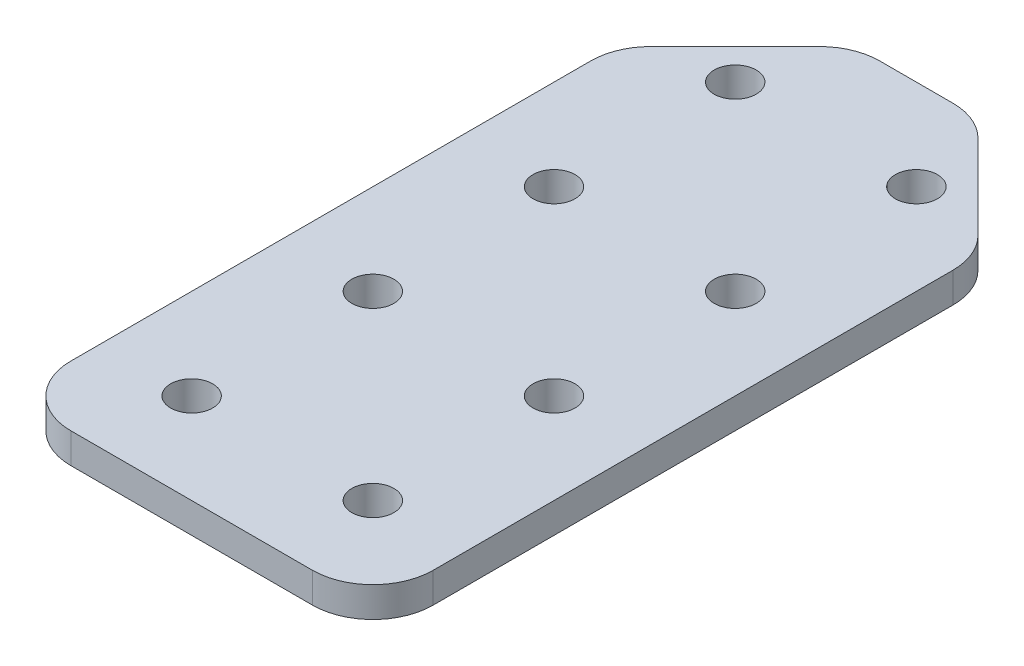
ISO-10303-21;
HEADER;
FILE_DESCRIPTION(('STEP AP214'),'2;1');
FILE_NAME('part.step','',(''),(''),'','','');
FILE_SCHEMA(('AUTOMOTIVE_DESIGN { 1 0 10303 214 1 1 1 1 }'));
ENDSEC;
DATA;
#1=APPLICATION_CONTEXT('core data for automotive mechanical design processes');
#2=APPLICATION_PROTOCOL_DEFINITION('international standard','automotive_design',2000,#1);
#3=PRODUCT_CONTEXT('',#1,'mechanical');
#4=PRODUCT('Part','Part','',(#3));
#5=PRODUCT_RELATED_PRODUCT_CATEGORY('part','',(#4));
#6=PRODUCT_DEFINITION_FORMATION('','',#4);
#7=PRODUCT_DEFINITION_CONTEXT('part definition',#1,'design');
#8=PRODUCT_DEFINITION('design','',#6,#7);
#9=PRODUCT_DEFINITION_SHAPE('','',#8);
#10=(LENGTH_UNIT() NAMED_UNIT(*) SI_UNIT(.MILLI.,.METRE.));
#11=(NAMED_UNIT(*) PLANE_ANGLE_UNIT() SI_UNIT($,.RADIAN.));
#12=(NAMED_UNIT(*) SI_UNIT($,.STERADIAN.) SOLID_ANGLE_UNIT());
#13=UNCERTAINTY_MEASURE_WITH_UNIT(LENGTH_MEASURE(1.E-05),#10,'distance_accuracy_value','');
#14=(GEOMETRIC_REPRESENTATION_CONTEXT(3) GLOBAL_UNCERTAINTY_ASSIGNED_CONTEXT((#13)) GLOBAL_UNIT_ASSIGNED_CONTEXT((#10,
#11,#12)) REPRESENTATION_CONTEXT('',''));
#15=CARTESIAN_POINT('',(0.,0.,0.));
#16=DIRECTION('',(0.,0.,1.));
#17=DIRECTION('',(1.,0.,0.));
#18=AXIS2_PLACEMENT_3D('',#15,#16,#17);
#19=CARTESIAN_POINT('',(38.1,3.175,76.2));
#20=DIRECTION('',(-1.,0.,0.));
#21=DIRECTION('',(0.,0.,1.));
#22=AXIS2_PLACEMENT_3D('',#19,#20,#21);
#23=PLANE('',#22);
#24=DIRECTION('',(0.,0.,-1.));
#25=VECTOR('',#24,1.);
#26=CARTESIAN_POINT('',(38.1,3.175,76.2));
#27=LINE('',#26,#25);
#28=CARTESIAN_POINT('',(38.1,3.175,63.5));
#29=VERTEX_POINT('',#28);
#30=CARTESIAN_POINT('',(38.1,3.175,-45.794770618868));
#31=VERTEX_POINT('',#30);
#32=EDGE_CURVE('E213',#29,#31,#27,.T.);
#33=ORIENTED_EDGE('',*,*,#32,.F.);
#34=DIRECTION('',(0.,-1.,0.));
#35=VECTOR('',#34,1.);
#36=CARTESIAN_POINT('',(38.1,3.175,63.5));
#37=LINE('',#36,#35);
#38=CARTESIAN_POINT('',(38.1,-3.175,63.5));
#39=VERTEX_POINT('',#38);
#40=EDGE_CURVE('E11',#29,#39,#37,.T.);
#41=ORIENTED_EDGE('',*,*,#40,.T.);
#42=DIRECTION('',(0.,0.,-1.));
#43=VECTOR('',#42,1.);
#44=CARTESIAN_POINT('',(38.1,-3.175,76.2));
#45=LINE('',#44,#43);
#46=CARTESIAN_POINT('',(38.1,-3.175,-45.794770618868));
#47=VERTEX_POINT('',#46);
#48=EDGE_CURVE('E210',#39,#47,#45,.T.);
#49=ORIENTED_EDGE('',*,*,#48,.T.);
#50=DIRECTION('',(0.,1.,0.));
#51=VECTOR('',#50,1.);
#52=CARTESIAN_POINT('',(38.1,3.175,-45.794770618868));
#53=LINE('',#52,#51);
#54=EDGE_CURVE('E47',#47,#31,#53,.T.);
#55=ORIENTED_EDGE('',*,*,#54,.T.);
#56=EDGE_LOOP('',(#33,#41,#49,#55));
#57=FACE_BOUND('',#56,.T.);
#58=ADVANCED_FACE('F39',(#57),#23,.F.);
#59=CARTESIAN_POINT('',(-38.1,3.175,-76.2));
#60=DIRECTION('',(0.,0.,1.));
#61=DIRECTION('',(1.,0.,0.));
#62=AXIS2_PLACEMENT_3D('',#59,#60,#61);
#63=PLANE('',#62);
#64=DIRECTION('',(-1.,0.,0.));
#65=VECTOR('',#64,1.);
#66=CARTESIAN_POINT('',(-38.1,3.175,-76.2));
#67=LINE('',#66,#65);
#68=CARTESIAN_POINT('',(7.69477061886781,3.175,-76.2));
#69=VERTEX_POINT('',#68);
#70=CARTESIAN_POINT('',(-7.6947706188681,3.175,-76.2));
#71=VERTEX_POINT('',#70);
#72=EDGE_CURVE('E215',#69,#71,#67,.T.);
#73=ORIENTED_EDGE('',*,*,#72,.F.);
#74=DIRECTION('',(0.,1.,0.));
#75=VECTOR('',#74,1.);
#76=CARTESIAN_POINT('',(7.69477061886782,3.175,-76.2));
#77=LINE('',#76,#75);
#78=CARTESIAN_POINT('',(7.69477061886781,-3.175,-76.2));
#79=VERTEX_POINT('',#78);
#80=EDGE_CURVE('E135',#69,#79,#77,.F.);
#81=ORIENTED_EDGE('',*,*,#80,.T.);
#82=DIRECTION('',(-1.,0.,0.));
#83=VECTOR('',#82,1.);
#84=CARTESIAN_POINT('',(-38.1,-3.175,-76.2));
#85=LINE('',#84,#83);
#86=CARTESIAN_POINT('',(-7.6947706188681,-3.175,-76.2));
#87=VERTEX_POINT('',#86);
#88=EDGE_CURVE('E226',#79,#87,#85,.T.);
#89=ORIENTED_EDGE('',*,*,#88,.T.);
#90=DIRECTION('',(0.,1.,0.));
#91=VECTOR('',#90,1.);
#92=CARTESIAN_POINT('',(-7.69477061886809,3.175,-76.2));
#93=LINE('',#92,#91);
#94=EDGE_CURVE('E140',#87,#71,#93,.T.);
#95=ORIENTED_EDGE('',*,*,#94,.T.);
#96=EDGE_LOOP('',(#73,#81,#89,#95));
#97=FACE_BOUND('',#96,.T.);
#98=ADVANCED_FACE('F295',(#97),#63,.F.);
#99=CARTESIAN_POINT('',(-38.1,3.175,76.2));
#100=DIRECTION('',(1.,0.,0.));
#101=DIRECTION('',(0.,0.,-1.));
#102=AXIS2_PLACEMENT_3D('',#99,#100,#101);
#103=PLANE('',#102);
#104=DIRECTION('',(0.,0.,1.));
#105=VECTOR('',#104,1.);
#106=CARTESIAN_POINT('',(-38.1,3.175,76.2));
#107=LINE('',#106,#105);
#108=CARTESIAN_POINT('',(-38.1,3.175,-45.794770618868));
#109=VERTEX_POINT('',#108);
#110=CARTESIAN_POINT('',(-38.1,3.175,63.5));
#111=VERTEX_POINT('',#110);
#112=EDGE_CURVE('E218',#109,#111,#107,.T.);
#113=ORIENTED_EDGE('',*,*,#112,.F.);
#114=DIRECTION('',(0.,1.,0.));
#115=VECTOR('',#114,1.);
#116=CARTESIAN_POINT('',(-38.1,3.175,-45.7947706188681));
#117=LINE('',#116,#115);
#118=CARTESIAN_POINT('',(-38.1,-3.175,-45.794770618868));
#119=VERTEX_POINT('',#118);
#120=EDGE_CURVE('E262',#109,#119,#117,.F.);
#121=ORIENTED_EDGE('',*,*,#120,.T.);
#122=DIRECTION('',(0.,0.,1.));
#123=VECTOR('',#122,1.);
#124=CARTESIAN_POINT('',(-38.1,-3.175,76.2));
#125=LINE('',#124,#123);
#126=CARTESIAN_POINT('',(-38.1,-3.175,63.5));
#127=VERTEX_POINT('',#126);
#128=EDGE_CURVE('E229',#119,#127,#125,.T.);
#129=ORIENTED_EDGE('',*,*,#128,.T.);
#130=DIRECTION('',(0.,-1.,0.));
#131=VECTOR('',#130,1.);
#132=CARTESIAN_POINT('',(-38.1,3.175,63.5));
#133=LINE('',#132,#131);
#134=EDGE_CURVE('E260',#127,#111,#133,.F.);
#135=ORIENTED_EDGE('',*,*,#134,.T.);
#136=EDGE_LOOP('',(#113,#121,#129,#135));
#137=FACE_BOUND('',#136,.T.);
#138=ADVANCED_FACE('F300',(#137),#103,.F.);
#139=CARTESIAN_POINT('',(-38.1,3.175,76.2));
#140=DIRECTION('',(0.,0.,-1.));
#141=DIRECTION('',(-1.,0.,0.));
#142=AXIS2_PLACEMENT_3D('',#139,#140,#141);
#143=PLANE('',#142);
#144=DIRECTION('',(1.,0.,0.));
#145=VECTOR('',#144,1.);
#146=CARTESIAN_POINT('',(-38.1,3.175,76.2));
#147=LINE('',#146,#145);
#148=CARTESIAN_POINT('',(-25.4,3.175,76.2));
#149=VERTEX_POINT('',#148);
#150=CARTESIAN_POINT('',(25.4,3.175,76.2));
#151=VERTEX_POINT('',#150);
#152=EDGE_CURVE('E221',#149,#151,#147,.T.);
#153=ORIENTED_EDGE('',*,*,#152,.F.);
#154=DIRECTION('',(0.,-1.,0.));
#155=VECTOR('',#154,1.);
#156=CARTESIAN_POINT('',(-25.4,3.175,76.2));
#157=LINE('',#156,#155);
#158=CARTESIAN_POINT('',(-25.4,-3.175,76.2));
#159=VERTEX_POINT('',#158);
#160=EDGE_CURVE('E266',#149,#159,#157,.T.);
#161=ORIENTED_EDGE('',*,*,#160,.T.);
#162=DIRECTION('',(1.,0.,0.));
#163=VECTOR('',#162,1.);
#164=CARTESIAN_POINT('',(-38.1,-3.175,76.2));
#165=LINE('',#164,#163);
#166=CARTESIAN_POINT('',(25.4,-3.175,76.2));
#167=VERTEX_POINT('',#166);
#168=EDGE_CURVE('E216',#159,#167,#165,.T.);
#169=ORIENTED_EDGE('',*,*,#168,.T.);
#170=DIRECTION('',(0.,-1.,0.));
#171=VECTOR('',#170,1.);
#172=CARTESIAN_POINT('',(25.4,3.175,76.2));
#173=LINE('',#172,#171);
#174=EDGE_CURVE('E264',#167,#151,#173,.F.);
#175=ORIENTED_EDGE('',*,*,#174,.T.);
#176=EDGE_LOOP('',(#153,#161,#169,#175));
#177=FACE_BOUND('',#176,.T.);
#178=ADVANCED_FACE('F320',(#177),#143,.F.);
#179=CARTESIAN_POINT('',(0.,3.175,0.));
#180=DIRECTION('',(0.,-1.,0.));
#181=DIRECTION('',(0.,0.,-1.));
#182=AXIS2_PLACEMENT_3D('',#179,#180,#181);
#183=PLANE('',#182);
#184=CARTESIAN_POINT('',(19.0500000000012,3.175,57.15));
#185=DIRECTION('',(0.,1.,0.));
#186=DIRECTION('',(0.,0.,1.));
#187=AXIS2_PLACEMENT_3D('',#184,#185,#186);
#188=CIRCLE('',#187,4.4196);
#189=CARTESIAN_POINT('',(19.0500000000012,3.175,61.5696));
#190=VERTEX_POINT('',#189);
#191=EDGE_CURVE('E181',#190,#190,#188,.T.);
#192=ORIENTED_EDGE('',*,*,#191,.F.);
#193=EDGE_LOOP('',(#192));
#194=FACE_BOUND('',#193,.T.);
#195=CARTESIAN_POINT('',(-19.0499999999996,3.175,-19.05));
#196=DIRECTION('',(0.,1.,0.));
#197=DIRECTION('',(0.,0.,1.));
#198=AXIS2_PLACEMENT_3D('',#195,#196,#197);
#199=CIRCLE('',#198,4.4196);
#200=CARTESIAN_POINT('',(-19.0499999999996,3.175,-14.6304));
#201=VERTEX_POINT('',#200);
#202=EDGE_CURVE('E168',#201,#201,#199,.T.);
#203=ORIENTED_EDGE('',*,*,#202,.F.);
#204=EDGE_LOOP('',(#203));
#205=FACE_BOUND('',#204,.T.);
#206=CARTESIAN_POINT('',(-19.0499999999992,3.175,19.05));
#207=DIRECTION('',(0.,1.,0.));
#208=DIRECTION('',(0.,0.,1.));
#209=AXIS2_PLACEMENT_3D('',#206,#207,#208);
#210=CIRCLE('',#209,4.4196);
#211=CARTESIAN_POINT('',(-19.0499999999992,3.175,23.4696));
#212=VERTEX_POINT('',#211);
#213=EDGE_CURVE('E169',#212,#212,#210,.T.);
#214=ORIENTED_EDGE('',*,*,#213,.F.);
#215=EDGE_LOOP('',(#214));
#216=FACE_BOUND('',#215,.T.);
#217=CARTESIAN_POINT('',(-19.0499999999988,3.175,57.15));
#218=DIRECTION('',(0.,1.,0.));
#219=DIRECTION('',(0.,0.,1.));
#220=AXIS2_PLACEMENT_3D('',#217,#218,#219);
#221=CIRCLE('',#220,4.4196);
#222=CARTESIAN_POINT('',(-19.0499999999988,3.175,61.5696));
#223=VERTEX_POINT('',#222);
#224=EDGE_CURVE('E163',#223,#223,#221,.T.);
#225=ORIENTED_EDGE('',*,*,#224,.F.);
#226=EDGE_LOOP('',(#225));
#227=FACE_BOUND('',#226,.T.);
#228=CARTESIAN_POINT('',(19.0500000000008,3.175,19.05));
#229=DIRECTION('',(0.,1.,0.));
#230=DIRECTION('',(0.,0.,1.));
#231=AXIS2_PLACEMENT_3D('',#228,#229,#230);
#232=CIRCLE('',#231,4.4196);
#233=CARTESIAN_POINT('',(19.0500000000008,3.175,23.4696));
#234=VERTEX_POINT('',#233);
#235=EDGE_CURVE('E180',#234,#234,#232,.T.);
#236=ORIENTED_EDGE('',*,*,#235,.F.);
#237=EDGE_LOOP('',(#236));
#238=FACE_BOUND('',#237,.T.);
#239=CARTESIAN_POINT('',(19.0500000000004,3.175,-19.05));
#240=DIRECTION('',(0.,1.,0.));
#241=DIRECTION('',(0.,0.,1.));
#242=AXIS2_PLACEMENT_3D('',#239,#240,#241);
#243=CIRCLE('',#242,4.4196);
#244=CARTESIAN_POINT('',(19.0500000000004,3.175,-14.6304));
#245=VERTEX_POINT('',#244);
#246=EDGE_CURVE('E199',#245,#245,#243,.T.);
#247=ORIENTED_EDGE('',*,*,#246,.F.);
#248=EDGE_LOOP('',(#247));
#249=FACE_BOUND('',#248,.T.);
#250=CARTESIAN_POINT('',(19.05,3.175,-57.15));
#251=DIRECTION('',(0.,1.,0.));
#252=DIRECTION('',(0.,0.,1.));
#253=AXIS2_PLACEMENT_3D('',#250,#251,#252);
#254=CIRCLE('',#253,4.4196);
#255=CARTESIAN_POINT('',(19.05,3.175,-52.7304));
#256=VERTEX_POINT('',#255);
#257=EDGE_CURVE('E193',#256,#256,#254,.T.);
#258=ORIENTED_EDGE('',*,*,#257,.F.);
#259=EDGE_LOOP('',(#258));
#260=FACE_BOUND('',#259,.T.);
#261=CARTESIAN_POINT('',(-19.05,3.175,-57.15));
#262=DIRECTION('',(0.,1.,0.));
#263=DIRECTION('',(0.,0.,1.));
#264=AXIS2_PLACEMENT_3D('',#261,#262,#263);
#265=CIRCLE('',#264,4.4196);
#266=CARTESIAN_POINT('',(-19.05,3.175,-52.7304));
#267=VERTEX_POINT('',#266);
#268=EDGE_CURVE('E192',#267,#267,#265,.T.);
#269=ORIENTED_EDGE('',*,*,#268,.F.);
#270=EDGE_LOOP('',(#269));
#271=FACE_BOUND('',#270,.T.);
#272=DIRECTION('',(0.707106781186551,0.,0.707106781186544));
#273=VECTOR('',#272,1.);
#274=CARTESIAN_POINT('',(38.1,3.175,-51.0552828610064));
#275=LINE('',#274,#273);
#276=CARTESIAN_POINT('',(16.6750267399369,3.175,-72.4802561210692));
#277=VERTEX_POINT('',#276);
#278=CARTESIAN_POINT('',(34.3802561210691,3.175,-54.7750267399372));
#279=VERTEX_POINT('',#278);
#280=EDGE_CURVE('E147',#277,#279,#275,.T.);
#281=ORIENTED_EDGE('',*,*,#280,.F.);
#282=CARTESIAN_POINT('',(7.69477061886782,3.175,-63.5));
#283=DIRECTION('',(0.,-1.,0.));
#284=DIRECTION('',(0.,0.,-1.));
#285=AXIS2_PLACEMENT_3D('',#282,#283,#284);
#286=CIRCLE('',#285,12.7);
#287=EDGE_CURVE('E130',#277,#69,#286,.F.);
#288=ORIENTED_EDGE('',*,*,#287,.T.);
#289=ORIENTED_EDGE('',*,*,#72,.T.);
#290=CARTESIAN_POINT('',(-7.69477061886809,3.175,-63.5));
#291=DIRECTION('',(0.,-1.,0.));
#292=DIRECTION('',(0.,0.,-1.));
#293=AXIS2_PLACEMENT_3D('',#290,#291,#292);
#294=CIRCLE('',#293,12.7);
#295=CARTESIAN_POINT('',(-16.6750267399372,3.175,-72.4802561210691));
#296=VERTEX_POINT('',#295);
#297=EDGE_CURVE('E151',#71,#296,#294,.F.);
#298=ORIENTED_EDGE('',*,*,#297,.T.);
#299=DIRECTION('',(0.707106781186547,0.,-0.707106781186548));
#300=VECTOR('',#299,1.);
#301=CARTESIAN_POINT('',(-38.1,3.175,-51.0552828610064));
#302=LINE('',#301,#300);
#303=CARTESIAN_POINT('',(-34.3802561210692,3.175,-54.7750267399372));
#304=VERTEX_POINT('',#303);
#305=EDGE_CURVE('E158',#304,#296,#302,.T.);
#306=ORIENTED_EDGE('',*,*,#305,.F.);
#307=CARTESIAN_POINT('',(-25.4,3.175,-45.7947706188681));
#308=DIRECTION('',(0.,-1.,0.));
#309=DIRECTION('',(0.,0.,-1.));
#310=AXIS2_PLACEMENT_3D('',#307,#308,#309);
#311=CIRCLE('',#310,12.7);
#312=EDGE_CURVE('E141',#304,#109,#311,.F.);
#313=ORIENTED_EDGE('',*,*,#312,.T.);
#314=ORIENTED_EDGE('',*,*,#112,.T.);
#315=CARTESIAN_POINT('',(-25.4,3.175,63.5));
#316=DIRECTION('',(0.,-1.,0.));
#317=DIRECTION('',(0.,0.,-1.));
#318=AXIS2_PLACEMENT_3D('',#315,#316,#317);
#319=CIRCLE('',#318,12.7);
#320=EDGE_CURVE('E239',#111,#149,#319,.F.);
#321=ORIENTED_EDGE('',*,*,#320,.T.);
#322=ORIENTED_EDGE('',*,*,#152,.T.);
#323=CARTESIAN_POINT('',(25.4,3.175,63.5));
#324=DIRECTION('',(0.,-1.,0.));
#325=DIRECTION('',(0.,0.,-1.));
#326=AXIS2_PLACEMENT_3D('',#323,#324,#325);
#327=CIRCLE('',#326,12.7);
#328=EDGE_CURVE('E237',#151,#29,#327,.F.);
#329=ORIENTED_EDGE('',*,*,#328,.T.);
#330=ORIENTED_EDGE('',*,*,#32,.T.);
#331=CARTESIAN_POINT('',(25.4,3.175,-45.794770618868));
#332=DIRECTION('',(0.,-1.,0.));
#333=DIRECTION('',(0.,0.,-1.));
#334=AXIS2_PLACEMENT_3D('',#331,#332,#333);
#335=CIRCLE('',#334,12.7);
#336=EDGE_CURVE('E156',#31,#279,#335,.F.);
#337=ORIENTED_EDGE('',*,*,#336,.T.);
#338=EDGE_LOOP('',(#281,#288,#289,#298,#306,#313,#314,#321,#322,#329,#330,#337));
#339=FACE_BOUND('',#338,.T.);
#340=ADVANCED_FACE('F154',(#194,#205,#216,#227,#238,#249,#260,#271,#339),#183,.F.);
#341=CARTESIAN_POINT('',(0.,-3.175,0.));
#342=DIRECTION('',(0.,-1.,0.));
#343=DIRECTION('',(0.,0.,-1.));
#344=AXIS2_PLACEMENT_3D('',#341,#342,#343);
#345=PLANE('',#344);
#346=ORIENTED_EDGE('',*,*,#88,.F.);
#347=CARTESIAN_POINT('',(7.69477061886782,-3.175,-63.5));
#348=DIRECTION('',(0.,-1.,0.));
#349=DIRECTION('',(0.,0.,-1.));
#350=AXIS2_PLACEMENT_3D('',#347,#348,#349);
#351=CIRCLE('',#350,12.7);
#352=CARTESIAN_POINT('',(16.6750267399369,-3.175,-72.4802561210692));
#353=VERTEX_POINT('',#352);
#354=EDGE_CURVE('E254',#79,#353,#351,.T.);
#355=ORIENTED_EDGE('',*,*,#354,.T.);
#356=DIRECTION('',(0.707106781186551,0.,0.707106781186544));
#357=VECTOR('',#356,1.);
#358=CARTESIAN_POINT('',(38.1,-3.175,-51.0552828610064));
#359=LINE('',#358,#357);
#360=CARTESIAN_POINT('',(34.3802561210691,-3.175,-54.7750267399372));
#361=VERTEX_POINT('',#360);
#362=EDGE_CURVE('E150',#353,#361,#359,.T.);
#363=ORIENTED_EDGE('',*,*,#362,.T.);
#364=CARTESIAN_POINT('',(25.4,-3.175,-45.794770618868));
#365=DIRECTION('',(0.,-1.,0.));
#366=DIRECTION('',(0.,0.,-1.));
#367=AXIS2_PLACEMENT_3D('',#364,#365,#366);
#368=CIRCLE('',#367,12.7);
#369=EDGE_CURVE('E247',#361,#47,#368,.T.);
#370=ORIENTED_EDGE('',*,*,#369,.T.);
#371=ORIENTED_EDGE('',*,*,#48,.F.);
#372=CARTESIAN_POINT('',(25.4,-3.175,63.5));
#373=DIRECTION('',(0.,-1.,0.));
#374=DIRECTION('',(0.,0.,-1.));
#375=AXIS2_PLACEMENT_3D('',#372,#373,#374);
#376=CIRCLE('',#375,12.7);
#377=EDGE_CURVE('E249',#39,#167,#376,.T.);
#378=ORIENTED_EDGE('',*,*,#377,.T.);
#379=ORIENTED_EDGE('',*,*,#168,.F.);
#380=CARTESIAN_POINT('',(-25.4,-3.175,63.5));
#381=DIRECTION('',(0.,-1.,0.));
#382=DIRECTION('',(0.,0.,-1.));
#383=AXIS2_PLACEMENT_3D('',#380,#381,#382);
#384=CIRCLE('',#383,12.7);
#385=EDGE_CURVE('E251',#159,#127,#384,.T.);
#386=ORIENTED_EDGE('',*,*,#385,.T.);
#387=ORIENTED_EDGE('',*,*,#128,.F.);
#388=CARTESIAN_POINT('',(-25.4,-3.175,-45.7947706188681));
#389=DIRECTION('',(0.,-1.,0.));
#390=DIRECTION('',(0.,0.,-1.));
#391=AXIS2_PLACEMENT_3D('',#388,#389,#390);
#392=CIRCLE('',#391,12.7);
#393=CARTESIAN_POINT('',(-34.3802561210692,-3.175,-54.7750267399372));
#394=VERTEX_POINT('',#393);
#395=EDGE_CURVE('E61',#119,#394,#392,.T.);
#396=ORIENTED_EDGE('',*,*,#395,.T.);
#397=DIRECTION('',(0.707106781186547,0.,-0.707106781186548));
#398=VECTOR('',#397,1.);
#399=CARTESIAN_POINT('',(-38.1,-3.175,-51.0552828610064));
#400=LINE('',#399,#398);
#401=CARTESIAN_POINT('',(-16.6750267399372,-3.175,-72.4802561210691));
#402=VERTEX_POINT('',#401);
#403=EDGE_CURVE('E161',#394,#402,#400,.T.);
#404=ORIENTED_EDGE('',*,*,#403,.T.);
#405=CARTESIAN_POINT('',(-7.69477061886809,-3.175,-63.5));
#406=DIRECTION('',(0.,-1.,0.));
#407=DIRECTION('',(0.,0.,-1.));
#408=AXIS2_PLACEMENT_3D('',#405,#406,#407);
#409=CIRCLE('',#408,12.7);
#410=EDGE_CURVE('E245',#402,#87,#409,.T.);
#411=ORIENTED_EDGE('',*,*,#410,.T.);
#412=EDGE_LOOP('',(#346,#355,#363,#370,#371,#378,#379,#386,#387,#396,#404,#411));
#413=FACE_BOUND('',#412,.T.);
#414=CARTESIAN_POINT('',(19.0500000000012,-3.175,57.15));
#415=DIRECTION('',(0.,1.,0.));
#416=DIRECTION('',(0.,0.,1.));
#417=AXIS2_PLACEMENT_3D('',#414,#415,#416);
#418=CIRCLE('',#417,4.4196);
#419=CARTESIAN_POINT('',(19.0500000000012,-3.175,61.5696));
#420=VERTEX_POINT('',#419);
#421=EDGE_CURVE('E177',#420,#420,#418,.T.);
#422=ORIENTED_EDGE('',*,*,#421,.T.);
#423=EDGE_LOOP('',(#422));
#424=FACE_BOUND('',#423,.T.);
#425=CARTESIAN_POINT('',(-19.0499999999996,-3.175,-19.05));
#426=DIRECTION('',(0.,1.,0.));
#427=DIRECTION('',(0.,0.,1.));
#428=AXIS2_PLACEMENT_3D('',#425,#426,#427);
#429=CIRCLE('',#428,4.4196);
#430=CARTESIAN_POINT('',(-19.0499999999996,-3.175,-14.6304));
#431=VERTEX_POINT('',#430);
#432=EDGE_CURVE('E184',#431,#431,#429,.T.);
#433=ORIENTED_EDGE('',*,*,#432,.T.);
#434=EDGE_LOOP('',(#433));
#435=FACE_BOUND('',#434,.T.);
#436=CARTESIAN_POINT('',(-19.0499999999992,-3.175,19.05));
#437=DIRECTION('',(0.,1.,0.));
#438=DIRECTION('',(0.,0.,1.));
#439=AXIS2_PLACEMENT_3D('',#436,#437,#438);
#440=CIRCLE('',#439,4.4196);
#441=CARTESIAN_POINT('',(-19.0499999999992,-3.175,23.4696));
#442=VERTEX_POINT('',#441);
#443=EDGE_CURVE('E165',#442,#442,#440,.T.);
#444=ORIENTED_EDGE('',*,*,#443,.T.);
#445=EDGE_LOOP('',(#444));
#446=FACE_BOUND('',#445,.T.);
#447=CARTESIAN_POINT('',(-19.0499999999988,-3.175,57.15));
#448=DIRECTION('',(0.,1.,0.));
#449=DIRECTION('',(0.,0.,1.));
#450=AXIS2_PLACEMENT_3D('',#447,#448,#449);
#451=CIRCLE('',#450,4.4196);
#452=CARTESIAN_POINT('',(-19.0499999999988,-3.175,61.5696));
#453=VERTEX_POINT('',#452);
#454=EDGE_CURVE('E172',#453,#453,#451,.T.);
#455=ORIENTED_EDGE('',*,*,#454,.T.);
#456=EDGE_LOOP('',(#455));
#457=FACE_BOUND('',#456,.T.);
#458=CARTESIAN_POINT('',(19.0500000000008,-3.175,19.05));
#459=DIRECTION('',(0.,1.,0.));
#460=DIRECTION('',(0.,0.,1.));
#461=AXIS2_PLACEMENT_3D('',#458,#459,#460);
#462=CIRCLE('',#461,4.4196);
#463=CARTESIAN_POINT('',(19.0500000000008,-3.175,23.4696));
#464=VERTEX_POINT('',#463);
#465=EDGE_CURVE('E202',#464,#464,#462,.T.);
#466=ORIENTED_EDGE('',*,*,#465,.T.);
#467=EDGE_LOOP('',(#466));
#468=FACE_BOUND('',#467,.T.);
#469=CARTESIAN_POINT('',(19.0500000000004,-3.175,-19.05));
#470=DIRECTION('',(0.,1.,0.));
#471=DIRECTION('',(0.,0.,1.));
#472=AXIS2_PLACEMENT_3D('',#469,#470,#471);
#473=CIRCLE('',#472,4.4196);
#474=CARTESIAN_POINT('',(19.0500000000004,-3.175,-14.6304));
#475=VERTEX_POINT('',#474);
#476=EDGE_CURVE('E196',#475,#475,#473,.T.);
#477=ORIENTED_EDGE('',*,*,#476,.T.);
#478=EDGE_LOOP('',(#477));
#479=FACE_BOUND('',#478,.T.);
#480=CARTESIAN_POINT('',(19.05,-3.175,-57.15));
#481=DIRECTION('',(0.,1.,0.));
#482=DIRECTION('',(0.,0.,1.));
#483=AXIS2_PLACEMENT_3D('',#480,#481,#482);
#484=CIRCLE('',#483,4.4196);
#485=CARTESIAN_POINT('',(19.05,-3.175,-52.7304));
#486=VERTEX_POINT('',#485);
#487=EDGE_CURVE('E189',#486,#486,#484,.T.);
#488=ORIENTED_EDGE('',*,*,#487,.T.);
#489=EDGE_LOOP('',(#488));
#490=FACE_BOUND('',#489,.T.);
#491=CARTESIAN_POINT('',(-19.05,-3.175,-57.15));
#492=DIRECTION('',(0.,1.,0.));
#493=DIRECTION('',(0.,0.,1.));
#494=AXIS2_PLACEMENT_3D('',#491,#492,#493);
#495=CIRCLE('',#494,4.4196);
#496=CARTESIAN_POINT('',(-19.05,-3.175,-52.7304));
#497=VERTEX_POINT('',#496);
#498=EDGE_CURVE('E207',#497,#497,#495,.T.);
#499=ORIENTED_EDGE('',*,*,#498,.T.);
#500=EDGE_LOOP('',(#499));
#501=FACE_BOUND('',#500,.T.);
#502=ADVANCED_FACE('F282',(#413,#424,#435,#446,#457,#468,#479,#490,#501),#345,.T.);
#503=CARTESIAN_POINT('',(-19.05,-3.175,-57.15));
#504=DIRECTION('',(0.,1.,0.));
#505=DIRECTION('',(0.,0.,1.));
#506=AXIS2_PLACEMENT_3D('',#503,#504,#505);
#507=CYLINDRICAL_SURFACE('',#506,4.4196);
#508=ORIENTED_EDGE('',*,*,#498,.F.);
#509=EDGE_LOOP('',(#508));
#510=FACE_BOUND('',#509,.T.);
#511=ORIENTED_EDGE('',*,*,#268,.T.);
#512=EDGE_LOOP('',(#511));
#513=FACE_BOUND('',#512,.T.);
#514=ADVANCED_FACE('F356',(#510,#513),#507,.F.);
#515=CARTESIAN_POINT('',(19.05,-3.175,-57.15));
#516=DIRECTION('',(0.,1.,0.));
#517=DIRECTION('',(0.,0.,1.));
#518=AXIS2_PLACEMENT_3D('',#515,#516,#517);
#519=CYLINDRICAL_SURFACE('',#518,4.4196);
#520=ORIENTED_EDGE('',*,*,#487,.F.);
#521=EDGE_LOOP('',(#520));
#522=FACE_BOUND('',#521,.T.);
#523=ORIENTED_EDGE('',*,*,#257,.T.);
#524=EDGE_LOOP('',(#523));
#525=FACE_BOUND('',#524,.T.);
#526=ADVANCED_FACE('F352',(#522,#525),#519,.F.);
#527=CARTESIAN_POINT('',(19.0500000000004,-3.175,-19.05));
#528=DIRECTION('',(0.,1.,0.));
#529=DIRECTION('',(0.,0.,1.));
#530=AXIS2_PLACEMENT_3D('',#527,#528,#529);
#531=CYLINDRICAL_SURFACE('',#530,4.4196);
#532=ORIENTED_EDGE('',*,*,#476,.F.);
#533=EDGE_LOOP('',(#532));
#534=FACE_BOUND('',#533,.T.);
#535=ORIENTED_EDGE('',*,*,#246,.T.);
#536=EDGE_LOOP('',(#535));
#537=FACE_BOUND('',#536,.T.);
#538=ADVANCED_FACE('F355',(#534,#537),#531,.F.);
#539=CARTESIAN_POINT('',(19.0500000000008,-3.175,19.05));
#540=DIRECTION('',(0.,1.,0.));
#541=DIRECTION('',(0.,0.,1.));
#542=AXIS2_PLACEMENT_3D('',#539,#540,#541);
#543=CYLINDRICAL_SURFACE('',#542,4.4196);
#544=ORIENTED_EDGE('',*,*,#465,.F.);
#545=EDGE_LOOP('',(#544));
#546=FACE_BOUND('',#545,.T.);
#547=ORIENTED_EDGE('',*,*,#235,.T.);
#548=EDGE_LOOP('',(#547));
#549=FACE_BOUND('',#548,.T.);
#550=ADVANCED_FACE('F346',(#546,#549),#543,.F.);
#551=CARTESIAN_POINT('',(-19.0499999999988,-3.175,57.15));
#552=DIRECTION('',(0.,1.,0.));
#553=DIRECTION('',(0.,0.,1.));
#554=AXIS2_PLACEMENT_3D('',#551,#552,#553);
#555=CYLINDRICAL_SURFACE('',#554,4.4196);
#556=ORIENTED_EDGE('',*,*,#454,.F.);
#557=EDGE_LOOP('',(#556));
#558=FACE_BOUND('',#557,.T.);
#559=ORIENTED_EDGE('',*,*,#224,.T.);
#560=EDGE_LOOP('',(#559));
#561=FACE_BOUND('',#560,.T.);
#562=ADVANCED_FACE('F343',(#558,#561),#555,.F.);
#563=CARTESIAN_POINT('',(-19.0499999999992,-3.175,19.05));
#564=DIRECTION('',(0.,1.,0.));
#565=DIRECTION('',(0.,0.,1.));
#566=AXIS2_PLACEMENT_3D('',#563,#564,#565);
#567=CYLINDRICAL_SURFACE('',#566,4.4196);
#568=ORIENTED_EDGE('',*,*,#443,.F.);
#569=EDGE_LOOP('',(#568));
#570=FACE_BOUND('',#569,.T.);
#571=ORIENTED_EDGE('',*,*,#213,.T.);
#572=EDGE_LOOP('',(#571));
#573=FACE_BOUND('',#572,.T.);
#574=ADVANCED_FACE('F340',(#570,#573),#567,.F.);
#575=CARTESIAN_POINT('',(-19.0499999999996,-3.175,-19.05));
#576=DIRECTION('',(0.,1.,0.));
#577=DIRECTION('',(0.,0.,1.));
#578=AXIS2_PLACEMENT_3D('',#575,#576,#577);
#579=CYLINDRICAL_SURFACE('',#578,4.4196);
#580=ORIENTED_EDGE('',*,*,#432,.F.);
#581=EDGE_LOOP('',(#580));
#582=FACE_BOUND('',#581,.T.);
#583=ORIENTED_EDGE('',*,*,#202,.T.);
#584=EDGE_LOOP('',(#583));
#585=FACE_BOUND('',#584,.T.);
#586=ADVANCED_FACE('F336',(#582,#585),#579,.F.);
#587=CARTESIAN_POINT('',(19.0500000000012,-3.175,57.15));
#588=DIRECTION('',(0.,1.,0.));
#589=DIRECTION('',(0.,0.,1.));
#590=AXIS2_PLACEMENT_3D('',#587,#588,#589);
#591=CYLINDRICAL_SURFACE('',#590,4.4196);
#592=ORIENTED_EDGE('',*,*,#421,.F.);
#593=EDGE_LOOP('',(#592));
#594=FACE_BOUND('',#593,.T.);
#595=ORIENTED_EDGE('',*,*,#191,.T.);
#596=EDGE_LOOP('',(#595));
#597=FACE_BOUND('',#596,.T.);
#598=ADVANCED_FACE('F329',(#594,#597),#591,.F.);
#599=CARTESIAN_POINT('',(-38.1,-3.175,-51.0552828610064));
#600=DIRECTION('',(0.707106781186548,0.,0.707106781186547));
#601=DIRECTION('',(0.707106781186547,0.,-0.707106781186548));
#602=AXIS2_PLACEMENT_3D('',#599,#600,#601);
#603=PLANE('',#602);
#604=ORIENTED_EDGE('',*,*,#403,.F.);
#605=DIRECTION('',(0.,1.,0.));
#606=VECTOR('',#605,1.);
#607=CARTESIAN_POINT('',(-34.3802561210692,-3.175,-54.7750267399372));
#608=LINE('',#607,#606);
#609=EDGE_CURVE('E257',#394,#304,#608,.T.);
#610=ORIENTED_EDGE('',*,*,#609,.T.);
#611=ORIENTED_EDGE('',*,*,#305,.T.);
#612=DIRECTION('',(0.,1.,0.));
#613=VECTOR('',#612,1.);
#614=CARTESIAN_POINT('',(-16.6750267399372,-3.175,-72.4802561210691));
#615=LINE('',#614,#613);
#616=EDGE_CURVE('E54',#296,#402,#615,.F.);
#617=ORIENTED_EDGE('',*,*,#616,.T.);
#618=EDGE_LOOP('',(#604,#610,#611,#617));
#619=FACE_BOUND('',#618,.T.);
#620=ADVANCED_FACE('F325',(#619),#603,.F.);
#621=CARTESIAN_POINT('',(38.1,-3.175,-51.0552828610064));
#622=DIRECTION('',(-0.707106781186544,0.,0.707106781186551));
#623=DIRECTION('',(0.707106781186551,0.,0.707106781186544));
#624=AXIS2_PLACEMENT_3D('',#621,#622,#623);
#625=PLANE('',#624);
#626=ORIENTED_EDGE('',*,*,#362,.F.);
#627=DIRECTION('',(0.,1.,0.));
#628=VECTOR('',#627,1.);
#629=CARTESIAN_POINT('',(16.6750267399369,-3.175,-72.4802561210692));
#630=LINE('',#629,#628);
#631=EDGE_CURVE('E134',#353,#277,#630,.T.);
#632=ORIENTED_EDGE('',*,*,#631,.T.);
#633=ORIENTED_EDGE('',*,*,#280,.T.);
#634=DIRECTION('',(0.,1.,0.));
#635=VECTOR('',#634,1.);
#636=CARTESIAN_POINT('',(34.3802561210691,-3.175,-54.7750267399372));
#637=LINE('',#636,#635);
#638=EDGE_CURVE('E152',#279,#361,#637,.F.);
#639=ORIENTED_EDGE('',*,*,#638,.T.);
#640=EDGE_LOOP('',(#626,#632,#633,#639));
#641=FACE_BOUND('',#640,.T.);
#642=ADVANCED_FACE('F146',(#641),#625,.F.);
#643=CARTESIAN_POINT('',(7.69477061886782,-3.175,-63.5));
#644=DIRECTION('',(0.,1.,0.));
#645=DIRECTION('',(0.,0.,1.));
#646=AXIS2_PLACEMENT_3D('',#643,#644,#645);
#647=CYLINDRICAL_SURFACE('',#646,12.7);
#648=ORIENTED_EDGE('',*,*,#354,.F.);
#649=ORIENTED_EDGE('',*,*,#80,.F.);
#650=ORIENTED_EDGE('',*,*,#287,.F.);
#651=ORIENTED_EDGE('',*,*,#631,.F.);
#652=EDGE_LOOP('',(#648,#649,#650,#651));
#653=FACE_BOUND('',#652,.T.);
#654=ADVANCED_FACE('F133',(#653),#647,.T.);
#655=CARTESIAN_POINT('',(-25.4,-3.175,-45.7947706188681));
#656=DIRECTION('',(0.,1.,0.));
#657=DIRECTION('',(0.,0.,1.));
#658=AXIS2_PLACEMENT_3D('',#655,#656,#657);
#659=CYLINDRICAL_SURFACE('',#658,12.7);
#660=ORIENTED_EDGE('',*,*,#395,.F.);
#661=ORIENTED_EDGE('',*,*,#120,.F.);
#662=ORIENTED_EDGE('',*,*,#312,.F.);
#663=ORIENTED_EDGE('',*,*,#609,.F.);
#664=EDGE_LOOP('',(#660,#661,#662,#663));
#665=FACE_BOUND('',#664,.T.);
#666=ADVANCED_FACE('F307',(#665),#659,.T.);
#667=CARTESIAN_POINT('',(-25.4,3.175,63.5));
#668=DIRECTION('',(0.,-1.,0.));
#669=DIRECTION('',(0.,0.,-1.));
#670=AXIS2_PLACEMENT_3D('',#667,#668,#669);
#671=CYLINDRICAL_SURFACE('',#670,12.7);
#672=ORIENTED_EDGE('',*,*,#320,.F.);
#673=ORIENTED_EDGE('',*,*,#134,.F.);
#674=ORIENTED_EDGE('',*,*,#385,.F.);
#675=ORIENTED_EDGE('',*,*,#160,.F.);
#676=EDGE_LOOP('',(#672,#673,#674,#675));
#677=FACE_BOUND('',#676,.T.);
#678=ADVANCED_FACE('F292',(#677),#671,.T.);
#679=CARTESIAN_POINT('',(25.4,3.175,63.5));
#680=DIRECTION('',(0.,-1.,0.));
#681=DIRECTION('',(0.,0.,-1.));
#682=AXIS2_PLACEMENT_3D('',#679,#680,#681);
#683=CYLINDRICAL_SURFACE('',#682,12.7);
#684=ORIENTED_EDGE('',*,*,#328,.F.);
#685=ORIENTED_EDGE('',*,*,#174,.F.);
#686=ORIENTED_EDGE('',*,*,#377,.F.);
#687=ORIENTED_EDGE('',*,*,#40,.F.);
#688=EDGE_LOOP('',(#684,#685,#686,#687));
#689=FACE_BOUND('',#688,.T.);
#690=ADVANCED_FACE('F280',(#689),#683,.T.);
#691=CARTESIAN_POINT('',(25.4,3.175,-45.794770618868));
#692=DIRECTION('',(0.,1.,0.));
#693=DIRECTION('',(0.,0.,1.));
#694=AXIS2_PLACEMENT_3D('',#691,#692,#693);
#695=CYLINDRICAL_SURFACE('',#694,12.7);
#696=ORIENTED_EDGE('',*,*,#369,.F.);
#697=ORIENTED_EDGE('',*,*,#638,.F.);
#698=ORIENTED_EDGE('',*,*,#336,.F.);
#699=ORIENTED_EDGE('',*,*,#54,.F.);
#700=EDGE_LOOP('',(#696,#697,#698,#699));
#701=FACE_BOUND('',#700,.T.);
#702=ADVANCED_FACE('F285',(#701),#695,.T.);
#703=CARTESIAN_POINT('',(-7.69477061886809,3.175,-63.5));
#704=DIRECTION('',(0.,1.,0.));
#705=DIRECTION('',(0.,0.,1.));
#706=AXIS2_PLACEMENT_3D('',#703,#704,#705);
#707=CYLINDRICAL_SURFACE('',#706,12.7);
#708=ORIENTED_EDGE('',*,*,#410,.F.);
#709=ORIENTED_EDGE('',*,*,#616,.F.);
#710=ORIENTED_EDGE('',*,*,#297,.F.);
#711=ORIENTED_EDGE('',*,*,#94,.F.);
#712=EDGE_LOOP('',(#708,#709,#710,#711));
#713=FACE_BOUND('',#712,.T.);
#714=ADVANCED_FACE('F41',(#713),#707,.T.);
#715=CLOSED_SHELL('',(#58,#98,#138,#178,#340,#502,#514,#526,#538,#550,#562,#574,#586,#598,#620,
#642,#654,#666,#678,#690,#702,#714));
#716=MANIFOLD_SOLID_BREP('B2',#715);
#717=ADVANCED_BREP_SHAPE_REPRESENTATION('',(#18,#716),#14);
#718=SHAPE_DEFINITION_REPRESENTATION(#9,#717);
ENDSEC;
END-ISO-10303-21;
